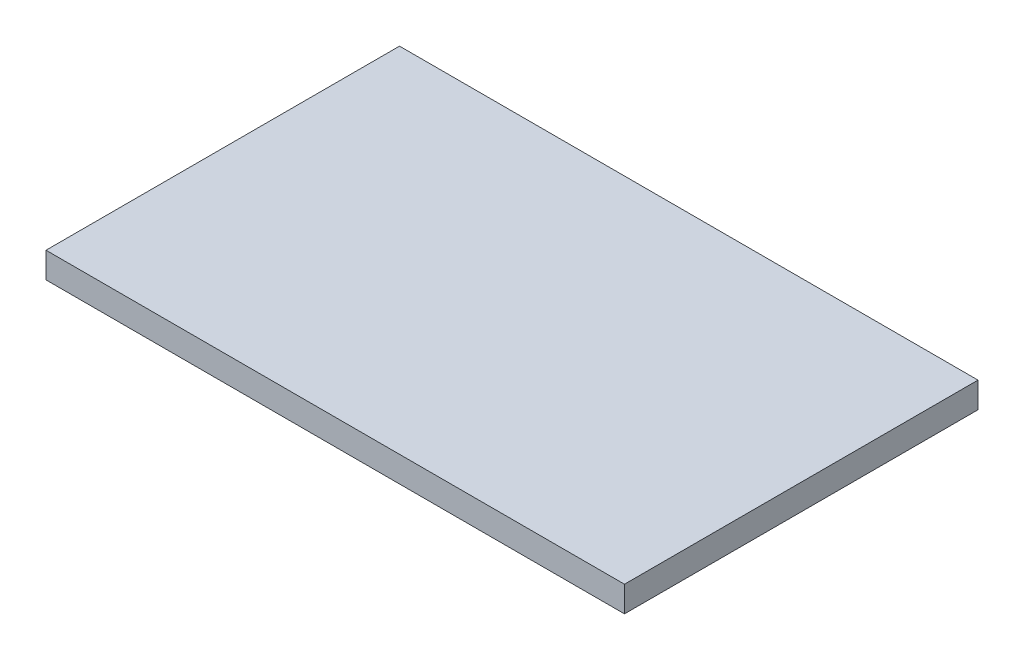
ISO-10303-21;
HEADER;
FILE_DESCRIPTION(('STEP AP214'),'2;1');
FILE_NAME('part.step','',(''),(''),'','','');
FILE_SCHEMA(('AUTOMOTIVE_DESIGN { 1 0 10303 214 1 1 1 1 }'));
ENDSEC;
DATA;
#1=APPLICATION_CONTEXT('core data for automotive mechanical design processes');
#2=APPLICATION_PROTOCOL_DEFINITION('international standard','automotive_design',2000,#1);
#3=PRODUCT_CONTEXT('',#1,'mechanical');
#4=PRODUCT('Part','Part','',(#3));
#5=PRODUCT_RELATED_PRODUCT_CATEGORY('part','',(#4));
#6=PRODUCT_DEFINITION_FORMATION('','',#4);
#7=PRODUCT_DEFINITION_CONTEXT('part definition',#1,'design');
#8=PRODUCT_DEFINITION('design','',#6,#7);
#9=PRODUCT_DEFINITION_SHAPE('','',#8);
#10=(LENGTH_UNIT() NAMED_UNIT(*) SI_UNIT(.MILLI.,.METRE.));
#11=(NAMED_UNIT(*) PLANE_ANGLE_UNIT() SI_UNIT($,.RADIAN.));
#12=(NAMED_UNIT(*) SI_UNIT($,.STERADIAN.) SOLID_ANGLE_UNIT());
#13=UNCERTAINTY_MEASURE_WITH_UNIT(LENGTH_MEASURE(1.E-05),#10,'distance_accuracy_value','');
#14=(GEOMETRIC_REPRESENTATION_CONTEXT(3) GLOBAL_UNCERTAINTY_ASSIGNED_CONTEXT((#13)) GLOBAL_UNIT_ASSIGNED_CONTEXT((#10,
#11,#12)) REPRESENTATION_CONTEXT('',''));
#15=CARTESIAN_POINT('',(0.,0.,0.));
#16=DIRECTION('',(0.,0.,1.));
#17=DIRECTION('',(1.,0.,0.));
#18=AXIS2_PLACEMENT_3D('',#15,#16,#17);
#19=CARTESIAN_POINT('',(-45.,4.,27.5));
#20=DIRECTION('',(1.,0.,0.));
#21=DIRECTION('',(0.,0.,-1.));
#22=AXIS2_PLACEMENT_3D('',#19,#20,#21);
#23=PLANE('',#22);
#24=DIRECTION('',(0.,0.,1.));
#25=VECTOR('',#24,1.);
#26=CARTESIAN_POINT('',(-45.,0.,27.5));
#27=LINE('',#26,#25);
#28=CARTESIAN_POINT('',(-45.,0.,-27.5));
#29=VERTEX_POINT('',#28);
#30=CARTESIAN_POINT('',(-45.,0.,27.5));
#31=VERTEX_POINT('',#30);
#32=EDGE_CURVE('E98',#29,#31,#27,.T.);
#33=ORIENTED_EDGE('',*,*,#32,.T.);
#34=DIRECTION('',(0.,-1.,0.));
#35=VECTOR('',#34,1.);
#36=CARTESIAN_POINT('',(-45.,4.,27.5));
#37=LINE('',#36,#35);
#38=CARTESIAN_POINT('',(-45.,4.,27.5));
#39=VERTEX_POINT('',#38);
#40=EDGE_CURVE('E11',#39,#31,#37,.T.);
#41=ORIENTED_EDGE('',*,*,#40,.F.);
#42=DIRECTION('',(0.,0.,1.));
#43=VECTOR('',#42,1.);
#44=CARTESIAN_POINT('',(-45.,4.,27.5));
#45=LINE('',#44,#43);
#46=CARTESIAN_POINT('',(-45.,4.,-27.5));
#47=VERTEX_POINT('',#46);
#48=EDGE_CURVE('E86',#47,#39,#45,.T.);
#49=ORIENTED_EDGE('',*,*,#48,.F.);
#50=DIRECTION('',(0.,-1.,0.));
#51=VECTOR('',#50,1.);
#52=CARTESIAN_POINT('',(-45.,4.,-27.5));
#53=LINE('',#52,#51);
#54=EDGE_CURVE('E94',#47,#29,#53,.T.);
#55=ORIENTED_EDGE('',*,*,#54,.T.);
#56=EDGE_LOOP('',(#33,#41,#49,#55));
#57=FACE_BOUND('',#56,.T.);
#58=ADVANCED_FACE('F35',(#57),#23,.F.);
#59=CARTESIAN_POINT('',(45.,4.,27.5));
#60=DIRECTION('',(0.,0.,-1.));
#61=DIRECTION('',(-1.,0.,0.));
#62=AXIS2_PLACEMENT_3D('',#59,#60,#61);
#63=PLANE('',#62);
#64=DIRECTION('',(1.,0.,0.));
#65=VECTOR('',#64,1.);
#66=CARTESIAN_POINT('',(45.,0.,27.5));
#67=LINE('',#66,#65);
#68=CARTESIAN_POINT('',(45.,0.,27.5));
#69=VERTEX_POINT('',#68);
#70=EDGE_CURVE('E90',#31,#69,#67,.T.);
#71=ORIENTED_EDGE('',*,*,#70,.T.);
#72=DIRECTION('',(0.,-1.,0.));
#73=VECTOR('',#72,1.);
#74=CARTESIAN_POINT('',(45.,4.,27.5));
#75=LINE('',#74,#73);
#76=CARTESIAN_POINT('',(45.,4.,27.5));
#77=VERTEX_POINT('',#76);
#78=EDGE_CURVE('E43',#77,#69,#75,.T.);
#79=ORIENTED_EDGE('',*,*,#78,.F.);
#80=DIRECTION('',(1.,0.,0.));
#81=VECTOR('',#80,1.);
#82=CARTESIAN_POINT('',(45.,4.,27.5));
#83=LINE('',#82,#81);
#84=EDGE_CURVE('E81',#39,#77,#83,.T.);
#85=ORIENTED_EDGE('',*,*,#84,.F.);
#86=ORIENTED_EDGE('',*,*,#40,.T.);
#87=EDGE_LOOP('',(#71,#79,#85,#86));
#88=FACE_BOUND('',#87,.T.);
#89=ADVANCED_FACE('F89',(#88),#63,.F.);
#90=CARTESIAN_POINT('',(45.,4.,27.5));
#91=DIRECTION('',(-1.,0.,0.));
#92=DIRECTION('',(0.,0.,1.));
#93=AXIS2_PLACEMENT_3D('',#90,#91,#92);
#94=PLANE('',#93);
#95=DIRECTION('',(0.,0.,-1.));
#96=VECTOR('',#95,1.);
#97=CARTESIAN_POINT('',(45.,0.,27.5));
#98=LINE('',#97,#96);
#99=CARTESIAN_POINT('',(45.,0.,-27.5));
#100=VERTEX_POINT('',#99);
#101=EDGE_CURVE('E68',#69,#100,#98,.T.);
#102=ORIENTED_EDGE('',*,*,#101,.T.);
#103=DIRECTION('',(0.,-1.,0.));
#104=VECTOR('',#103,1.);
#105=CARTESIAN_POINT('',(45.,4.,-27.5));
#106=LINE('',#105,#104);
#107=CARTESIAN_POINT('',(45.,4.,-27.5));
#108=VERTEX_POINT('',#107);
#109=EDGE_CURVE('E91',#108,#100,#106,.T.);
#110=ORIENTED_EDGE('',*,*,#109,.F.);
#111=DIRECTION('',(0.,0.,-1.));
#112=VECTOR('',#111,1.);
#113=CARTESIAN_POINT('',(45.,4.,27.5));
#114=LINE('',#113,#112);
#115=EDGE_CURVE('E84',#77,#108,#114,.T.);
#116=ORIENTED_EDGE('',*,*,#115,.F.);
#117=ORIENTED_EDGE('',*,*,#78,.T.);
#118=EDGE_LOOP('',(#102,#110,#116,#117));
#119=FACE_BOUND('',#118,.T.);
#120=ADVANCED_FACE('F92',(#119),#94,.F.);
#121=CARTESIAN_POINT('',(45.,4.,-27.5));
#122=DIRECTION('',(0.,0.,1.));
#123=DIRECTION('',(1.,0.,0.));
#124=AXIS2_PLACEMENT_3D('',#121,#122,#123);
#125=PLANE('',#124);
#126=DIRECTION('',(-1.,0.,0.));
#127=VECTOR('',#126,1.);
#128=CARTESIAN_POINT('',(45.,0.,-27.5));
#129=LINE('',#128,#127);
#130=EDGE_CURVE('E74',#100,#29,#129,.T.);
#131=ORIENTED_EDGE('',*,*,#130,.T.);
#132=ORIENTED_EDGE('',*,*,#54,.F.);
#133=DIRECTION('',(-1.,0.,0.));
#134=VECTOR('',#133,1.);
#135=CARTESIAN_POINT('',(45.,4.,-27.5));
#136=LINE('',#135,#134);
#137=EDGE_CURVE('E51',#108,#47,#136,.T.);
#138=ORIENTED_EDGE('',*,*,#137,.F.);
#139=ORIENTED_EDGE('',*,*,#109,.T.);
#140=EDGE_LOOP('',(#131,#132,#138,#139));
#141=FACE_BOUND('',#140,.T.);
#142=ADVANCED_FACE('F105',(#141),#125,.F.);
#143=CARTESIAN_POINT('',(0.,4.,0.));
#144=DIRECTION('',(0.,1.,0.));
#145=DIRECTION('',(0.,0.,1.));
#146=AXIS2_PLACEMENT_3D('',#143,#144,#145);
#147=PLANE('',#146);
#148=ORIENTED_EDGE('',*,*,#48,.T.);
#149=ORIENTED_EDGE('',*,*,#84,.T.);
#150=ORIENTED_EDGE('',*,*,#115,.T.);
#151=ORIENTED_EDGE('',*,*,#137,.T.);
#152=EDGE_LOOP('',(#148,#149,#150,#151));
#153=FACE_BOUND('',#152,.T.);
#154=ADVANCED_FACE('F82',(#153),#147,.T.);
#155=CARTESIAN_POINT('',(0.,0.,0.));
#156=DIRECTION('',(0.,1.,0.));
#157=DIRECTION('',(0.,0.,1.));
#158=AXIS2_PLACEMENT_3D('',#155,#156,#157);
#159=PLANE('',#158);
#160=ORIENTED_EDGE('',*,*,#32,.F.);
#161=ORIENTED_EDGE('',*,*,#130,.F.);
#162=ORIENTED_EDGE('',*,*,#101,.F.);
#163=ORIENTED_EDGE('',*,*,#70,.F.);
#164=EDGE_LOOP('',(#160,#161,#162,#163));
#165=FACE_BOUND('',#164,.T.);
#166=ADVANCED_FACE('F108',(#165),#159,.F.);
#167=CLOSED_SHELL('',(#58,#89,#120,#142,#154,#166));
#168=MANIFOLD_SOLID_BREP('B2',#167);
#169=ADVANCED_BREP_SHAPE_REPRESENTATION('',(#18,#168),#14);
#170=SHAPE_DEFINITION_REPRESENTATION(#9,#169);
ENDSEC;
END-ISO-10303-21;
